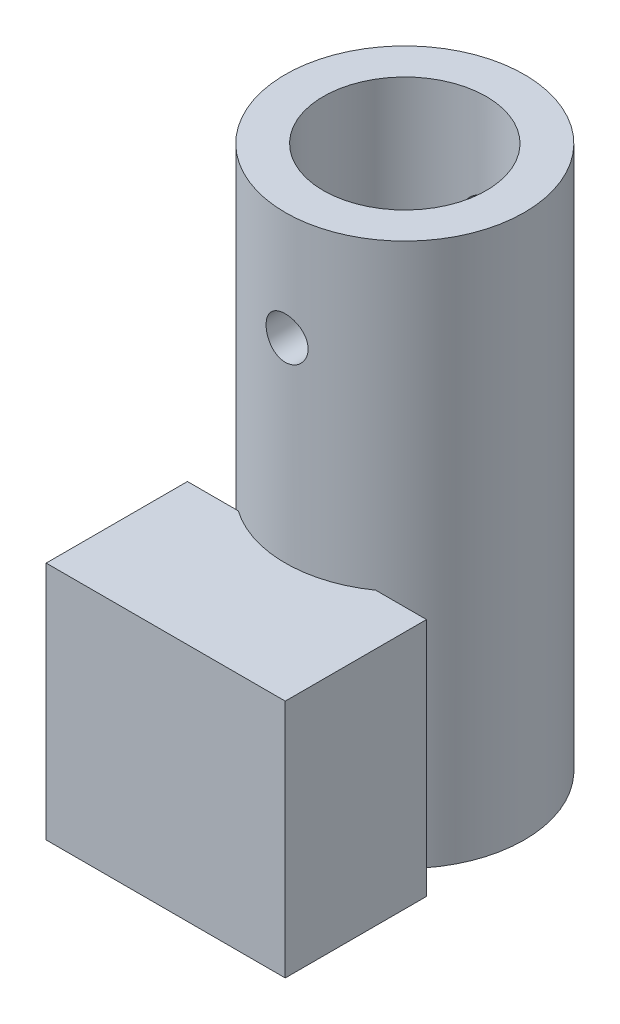
ISO-10303-21;
HEADER;
FILE_DESCRIPTION(('STEP AP214'),'2;1');
FILE_NAME('part.step','',(''),(''),'','','');
FILE_SCHEMA(('AUTOMOTIVE_DESIGN { 1 0 10303 214 1 1 1 1 }'));
ENDSEC;
DATA;
#1=APPLICATION_CONTEXT('core data for automotive mechanical design processes');
#2=APPLICATION_PROTOCOL_DEFINITION('international standard','automotive_design',2000,#1);
#3=PRODUCT_CONTEXT('',#1,'mechanical');
#4=PRODUCT('Part','Part','',(#3));
#5=PRODUCT_RELATED_PRODUCT_CATEGORY('part','',(#4));
#6=PRODUCT_DEFINITION_FORMATION('','',#4);
#7=PRODUCT_DEFINITION_CONTEXT('part definition',#1,'design');
#8=PRODUCT_DEFINITION('design','',#6,#7);
#9=PRODUCT_DEFINITION_SHAPE('','',#8);
#10=(LENGTH_UNIT() NAMED_UNIT(*) SI_UNIT(.MILLI.,.METRE.));
#11=(NAMED_UNIT(*) PLANE_ANGLE_UNIT() SI_UNIT($,.RADIAN.));
#12=(NAMED_UNIT(*) SI_UNIT($,.STERADIAN.) SOLID_ANGLE_UNIT());
#13=UNCERTAINTY_MEASURE_WITH_UNIT(LENGTH_MEASURE(1.E-05),#10,'distance_accuracy_value','');
#14=(GEOMETRIC_REPRESENTATION_CONTEXT(3) GLOBAL_UNCERTAINTY_ASSIGNED_CONTEXT((#13)) GLOBAL_UNIT_ASSIGNED_CONTEXT((#10,
#11,#12)) REPRESENTATION_CONTEXT('',''));
#15=CARTESIAN_POINT('',(0.,0.,0.));
#16=DIRECTION('',(0.,0.,1.));
#17=DIRECTION('',(1.,0.,0.));
#18=AXIS2_PLACEMENT_3D('',#15,#16,#17);
#19=CARTESIAN_POINT('',(0.,50.,0.));
#20=DIRECTION('',(0.,-1.,0.));
#21=DIRECTION('',(0.,0.,-1.));
#22=AXIS2_PLACEMENT_3D('',#19,#20,#21);
#23=CYLINDRICAL_SURFACE('',#22,11.);
#24=CARTESIAN_POINT('',(0.,41.935,-11.));
#25=CARTESIAN_POINT('',(-0.107798300732466,41.9349957604423,-10.9999980996234));
#26=CARTESIAN_POINT('',(-0.215653190352968,41.9259614447859,-10.9983989460169));
#27=CARTESIAN_POINT('',(-0.428331828274748,41.8900814433527,-10.9921736555933));
#28=CARTESIAN_POINT('',(-0.533152801481266,41.8632199570773,-10.987544833584));
#29=CARTESIAN_POINT('',(-0.736656342304242,41.7925268546714,-10.9757787933153));
#30=CARTESIAN_POINT('',(-0.835344073440022,41.7487097442508,-10.96864371966));
#31=CARTESIAN_POINT('',(-1.02395593211921,41.6453885879771,-10.9526473802527));
#32=CARTESIAN_POINT('',(-1.11388093398723,41.5858861093729,-10.9437862869841));
#33=CARTESIAN_POINT('',(-1.28337904046798,41.4522129081652,-10.9252133580473));
#34=CARTESIAN_POINT('',(-1.36284578997306,41.3779083236972,-10.9154942459053));
#35=CARTESIAN_POINT('',(-1.50825231814859,41.21702821766,-10.8963556449968));
#36=CARTESIAN_POINT('',(-1.57419119394373,41.1304518777029,-10.8869361762643));
#37=CARTESIAN_POINT('',(-1.69110342781324,40.9467461317815,-10.8693928195898));
#38=CARTESIAN_POINT('',(-1.74197030891694,40.8495479870297,-10.8612783264002));
#39=CARTESIAN_POINT('',(-1.82661342355483,40.6478197516009,-10.8473653474859));
#40=CARTESIAN_POINT('',(-1.86039094751275,40.543290215199,-10.8415666868987));
#41=CARTESIAN_POINT('',(-1.90955872088715,40.3309984978618,-10.8330147262082));
#42=CARTESIAN_POINT('',(-1.92513340824958,40.2232802870632,-10.8302309002416));
#43=CARTESIAN_POINT('',(-1.93802552688535,40.0067263262623,-10.8279316043739));
#44=CARTESIAN_POINT('',(-1.93534439770384,39.8978906650514,-10.82841587677));
#45=CARTESIAN_POINT('',(-1.91195092983359,39.6835162353439,-10.8325702229002));
#46=CARTESIAN_POINT('',(-1.89144686334163,39.5779539216925,-10.8362034971524));
#47=CARTESIAN_POINT('',(-1.83331689917424,39.3717913884573,-10.8461887816728));
#48=CARTESIAN_POINT('',(-1.79569035357035,39.2711913568099,-10.8525408948235));
#49=CARTESIAN_POINT('',(-1.70417558000238,39.0771916233636,-10.8672873363215));
#50=CARTESIAN_POINT('',(-1.6502018957683,38.9838330792564,-10.8756923505991));
#51=CARTESIAN_POINT('',(-1.52758552913526,38.8074190667515,-10.8935902992068));
#52=CARTESIAN_POINT('',(-1.45894153134716,38.7243645233009,-10.9030833310567));
#53=CARTESIAN_POINT('',(-1.30780340794176,38.5697114916149,-10.9222488122133));
#54=CARTESIAN_POINT('',(-1.22513082099987,38.4982873764564,-10.9319219268388));
#55=CARTESIAN_POINT('',(-1.04888309423207,38.3702974940319,-10.9502365753995));
#56=CARTESIAN_POINT('',(-0.955307868495456,38.3137318438593,-10.958878101205));
#57=CARTESIAN_POINT('',(-0.759739470105757,38.2170445203206,-10.9741703100929));
#58=CARTESIAN_POINT('',(-0.657737935531648,38.1769394230366,-10.9808189845293));
#59=CARTESIAN_POINT('',(-0.448303463594468,38.1144796591589,-10.9913605256456));
#60=CARTESIAN_POINT('',(-0.34087103410041,38.0921233360464,-10.9952536495013));
#61=CARTESIAN_POINT('',(-0.125126131602164,38.0660348324668,-10.9998105393369));
#62=CARTESIAN_POINT('',(-0.0168434269159108,38.062063474325,-11.0005157750175));
#63=CARTESIAN_POINT('',(0.198839479246955,38.0722182952537,-10.9987314265803));
#64=CARTESIAN_POINT('',(0.306239718496716,38.0863436956045,-10.9962419799325));
#65=CARTESIAN_POINT('',(0.516361680017287,38.1320921501891,-10.9883737169537));
#66=CARTESIAN_POINT('',(0.619110231632479,38.1635956682617,-10.9830146467512));
#67=CARTESIAN_POINT('',(0.817867386070802,38.2430778330117,-10.9700055402181));
#68=CARTESIAN_POINT('',(0.913875574961641,38.2910574904409,-10.9623553633402));
#69=CARTESIAN_POINT('',(1.09745781955809,38.402669824816,-10.9455094112871));
#70=CARTESIAN_POINT('',(1.18494054974232,38.4664505090025,-10.9362992983878));
#71=CARTESIAN_POINT('',(1.34804686850675,38.6076522372847,-10.9173954634863));
#72=CARTESIAN_POINT('',(1.42366948986564,38.685074392784,-10.9077017021261));
#73=CARTESIAN_POINT('',(1.56180513954747,38.8524384969719,-10.8887875146657));
#74=CARTESIAN_POINT('',(1.62415585191624,38.9425153070373,-10.8795738868835));
#75=CARTESIAN_POINT('',(1.73284091238269,39.1320048243113,-10.8627942623141));
#76=CARTESIAN_POINT('',(1.77917580830503,39.2314172120463,-10.8552282091746));
#77=CARTESIAN_POINT('',(1.85427658379618,39.4363200641377,-10.8426524166645));
#78=CARTESIAN_POINT('',(1.88312050121377,39.5417811983743,-10.8376313393446));
#79=CARTESIAN_POINT('',(1.92266414887922,39.7561481516085,-10.8306866209408));
#80=CARTESIAN_POINT('',(1.93336565573024,39.865053632253,-10.8287626765698));
#81=CARTESIAN_POINT('',(1.93626687128828,40.0815949496814,-10.8282441376828));
#82=CARTESIAN_POINT('',(1.92872228814715,40.1892273347505,-10.8296035288159));
#83=CARTESIAN_POINT('',(1.89590137941687,40.4016650425193,-10.8353971364659));
#84=CARTESIAN_POINT('',(1.87062513100653,40.506470377522,-10.8398313395993));
#85=CARTESIAN_POINT('',(1.80316068873677,40.7101634088313,-10.8512566409745));
#86=CARTESIAN_POINT('',(1.76099695964016,40.8090594287686,-10.8582440391436));
#87=CARTESIAN_POINT('',(1.66098137013199,40.9984151383559,-10.8739915643097));
#88=CARTESIAN_POINT('',(1.6031285877568,41.0888743317978,-10.882751795479));
#89=CARTESIAN_POINT('',(1.47247461621247,41.2600758432618,-10.9012025140866));
#90=CARTESIAN_POINT('',(1.39948615043526,41.3406741027276,-10.9109037564993));
#91=CARTESIAN_POINT('',(1.24102594293576,41.4885653507267,-10.9300599557264));
#92=CARTESIAN_POINT('',(1.15555133204841,41.5558552727771,-10.9395148553442));
#93=CARTESIAN_POINT('',(0.973750949857101,41.6757035683908,-10.9571988746708));
#94=CARTESIAN_POINT('',(0.877345868203405,41.7281431548607,-10.9654178765861));
#95=CARTESIAN_POINT('',(0.676985586704339,41.8160004318573,-10.9796055640486));
#96=CARTESIAN_POINT('',(0.573037837468801,41.8514346636333,-10.9855764351479));
#97=CARTESIAN_POINT('',(0.390605747327076,41.8967961789258,-10.9933286777153));
#98=CARTESIAN_POINT('',(0.313209862898434,41.9110990153308,-10.9958167297828));
#99=CARTESIAN_POINT('',(0.157219337263767,41.9302023745171,-10.9991530671462));
#100=CARTESIAN_POINT('',(0.0786247206788862,41.9350030922012,-11.0000013860755));
#101=CARTESIAN_POINT('',(0.,41.935,-11.));
#102=B_SPLINE_CURVE_WITH_KNOTS('',3,(#24,#25,#26,#27,#28,#29,#30,#31,#32,#33,#34,#35,#36,#37,
#38,#39,#40,#41,#42,#43,#44,#45,#46,#47,#48,#49,#50,#51,#52,#53,#54,#55,#56,#57,#58,#59,#60,#61,
#62,#63,#64,#65,#66,#67,#68,#69,#70,#71,#72,#73,#74,#75,#76,#77,#78,#79,#80,#81,#82,#83,#84,#85,
#86,#87,#88,#89,#90,#91,#92,#93,#94,#95,#96,#97,#98,#99,#100,#101),.UNSPECIFIED.,.T.,.F.,(4,2,2,
2,2,2,2,2,2,2,2,2,2,2,2,2,2,2,2,2,2,2,2,2,2,2,2,2,2,2,2,2,2,2,2,2,2,2,4),(0.,0.323107447197429,
0.646501652681637,0.969619800605967,1.29270567547517,1.61885808937813,1.94503226421979,
2.27345859304107,2.60186011856532,2.92690448959888,3.251923229863,3.57319421807926,
3.89447736446079,4.2174699203214,4.54049144892878,4.86798154151709,5.1954742148394,
5.52329587495172,5.85108693539623,6.17460141356272,6.49810197107546,6.81940457263364,
7.14072688847164,7.46518103509412,7.78966162801418,8.11790769974874,8.44614254263986,
8.77290194469031,9.09962934684071,9.42180445491817,9.74397816070528,10.0656868144076,
10.3874143773437,10.7133896528243,11.0394399516508,11.3680290438382,11.6962978635946,
11.9319671989006,12.1676317002197),.UNSPECIFIED.);
#103=CARTESIAN_POINT('',(0.,41.935,-11.));
#104=VERTEX_POINT('',#103);
#105=EDGE_CURVE('E142',#104,#104,#102,.T.);
#106=ORIENTED_EDGE('',*,*,#105,.T.);
#107=EDGE_LOOP('',(#106));
#108=FACE_BOUND('',#107,.T.);
#109=CARTESIAN_POINT('',(1.935,40.,10.8284705752936));
#110=CARTESIAN_POINT('',(1.93499574853755,39.8922162451031,10.8284725893971));
#111=CARTESIAN_POINT('',(1.92596378846799,39.7843758666896,10.8300973078839));
#112=CARTESIAN_POINT('',(1.89009399182154,39.5717273666734,10.8364137863099));
#113=CARTESIAN_POINT('',(1.86324030050737,39.4669220318571,10.8411082771543));
#114=CARTESIAN_POINT('',(1.79256999084182,39.2634515950013,10.853016529543));
#115=CARTESIAN_POINT('',(1.74876824557947,39.164781197009,10.8602280816501));
#116=CARTESIAN_POINT('',(1.64548329887357,38.9761985092646,10.876355285038));
#117=CARTESIAN_POINT('',(1.58600162849069,38.8862853655868,10.8852707699158));
#118=CARTESIAN_POINT('',(1.45234966973699,38.7167744004669,10.9039105266286));
#119=CARTESIAN_POINT('',(1.3780408525079,38.637286566215,10.9136418820687));
#120=CARTESIAN_POINT('',(1.21714335843051,38.4918391921289,10.9327541345797));
#121=CARTESIAN_POINT('',(1.13055392139233,38.4258804903883,10.9421350099098));
#122=CARTESIAN_POINT('',(0.946836173898078,38.308947095553,10.9595647093219));
#123=CARTESIAN_POINT('',(0.849641377666937,38.2580753542068,10.9676042244816));
#124=CARTESIAN_POINT('',(0.647920399116483,38.1734223373944,10.9813663374638));
#125=CARTESIAN_POINT('',(0.543394748042319,38.1396398249769,10.9870891029712));
#126=CARTESIAN_POINT('',(0.331117087773755,38.0904622569949,10.995522897195));
#127=CARTESIAN_POINT('',(0.223409180014938,38.0748821160419,10.9982642216657));
#128=CARTESIAN_POINT('',(0.00687555250102919,38.061975517667,11.0005304940157));
#129=CARTESIAN_POINT('',(-0.101950082397506,38.0646476846305,11.0000556842841));
#130=CARTESIAN_POINT('',(-0.316362888467173,38.0880265364185,10.9959670364676));
#131=CARTESIAN_POINT('',(-0.421972539379184,38.1085339902991,10.9923878770401));
#132=CARTESIAN_POINT('',(-0.628227980064162,38.1666869734296,10.9825314372781));
#133=CARTESIAN_POINT('',(-0.728873605359216,38.2043330701285,10.976254067608));
#134=CARTESIAN_POINT('',(-0.922930251180134,38.295889177031,10.9616479369522));
#135=CARTESIAN_POINT('',(-1.01630224054765,38.3498802245606,10.9533089934714));
#136=CARTESIAN_POINT('',(-1.19273586799729,38.4725341140617,10.935504374105));
#137=CARTESIAN_POINT('',(-1.27579657812861,38.5411982750108,10.9260385969615));
#138=CARTESIAN_POINT('',(-1.43042844581992,38.6923512567167,10.9068802994464));
#139=CARTESIAN_POINT('',(-1.50182924908665,38.7750142900563,10.8971864434054));
#140=CARTESIAN_POINT('',(-1.62977657086292,38.9512344068196,10.8787875875423));
#141=CARTESIAN_POINT('',(-1.68632292028936,39.0447916142304,10.8700825989767));
#142=CARTESIAN_POINT('',(-1.78299610574292,39.2403540149316,10.8546458350599));
#143=CARTESIAN_POINT('',(-1.82310061341606,39.3423704716483,10.8479167465148));
#144=CARTESIAN_POINT('',(-1.88555467891446,39.5518375392301,10.8372366065611));
#145=CARTESIAN_POINT('',(-1.90790599076062,39.6592876121364,10.8332852807134));
#146=CARTESIAN_POINT('',(-1.93397552796256,39.8750424512423,10.8286616854474));
#147=CARTESIAN_POINT('',(-1.93793741192634,39.9833168859175,10.8279465400777));
#148=CARTESIAN_POINT('',(-1.92776659552939,40.198981020864,10.8297618465244));
#149=CARTESIAN_POINT('',(-1.91363467759461,40.3063707591897,10.8322921579983));
#150=CARTESIAN_POINT('',(-1.86788577941721,40.5164315257679,10.840273522505));
#151=CARTESIAN_POINT('',(-1.83639441348221,40.6191307800221,10.8457035840023));
#152=CARTESIAN_POINT('',(-1.75695294380663,40.8177946773773,10.8588548031925));
#153=CARTESIAN_POINT('',(-1.70900175579265,40.9137588763121,10.8665761118144));
#154=CARTESIAN_POINT('',(-1.59743288225755,41.0973082984876,10.8835386021612));
#155=CARTESIAN_POINT('',(-1.53366000668246,41.1847978041181,10.8927945185677));
#156=CARTESIAN_POINT('',(-1.39246942548561,41.347921395965,10.9117409396742));
#157=CARTESIAN_POINT('',(-1.31505064605038,41.4235545483043,10.9214314785303));
#158=CARTESIAN_POINT('',(-1.14768259349554,41.5617170532962,10.9402918209418));
#159=CARTESIAN_POINT('',(-1.05759772738292,41.6240833149374,10.9494542343387));
#160=CARTESIAN_POINT('',(-0.868087556160912,41.7327956207474,10.9661049917731));
#161=CARTESIAN_POINT('',(-0.768662579122865,41.7791422273392,10.973593394579));
#162=CARTESIAN_POINT('',(-0.56376438203063,41.854249944736,10.9860204163005));
#163=CARTESIAN_POINT('',(-0.458322376321753,41.8830941337412,10.9909710634299));
#164=CARTESIAN_POINT('',(-0.243996097068897,41.9226447908804,10.9978158236253));
#165=CARTESIAN_POINT('',(-0.135112141465561,41.9333529293238,10.9997102181678));
#166=CARTESIAN_POINT('',(0.08143749398107,41.9362751088781,11.0002243524477));
#167=CARTESIAN_POINT('',(0.189099811305215,41.9287364996503,10.998887889417));
#168=CARTESIAN_POINT('',(0.401598959322069,41.8959170745163,10.9931805663424));
#169=CARTESIAN_POINT('',(0.506435810419884,41.8706363867765,10.9888097282185));
#170=CARTESIAN_POINT('',(0.710197969703897,41.8031494347866,10.9775236535447));
#171=CARTESIAN_POINT('',(0.809131209409462,41.7609664950959,10.9706119244224));
#172=CARTESIAN_POINT('',(0.998553458520875,41.6609008520625,10.9549958470054));
#173=CARTESIAN_POINT('',(1.08904199468149,41.6030172695576,10.9462913983335));
#174=CARTESIAN_POINT('',(1.2602465974113,41.4723274196824,10.9279136060408));
#175=CARTESIAN_POINT('',(1.34082401316346,41.3993410309346,10.9182293647678));
#176=CARTESIAN_POINT('',(1.48867417029126,41.2408938128045,10.8990559850883));
#177=CARTESIAN_POINT('',(1.55594378842538,41.1554300632383,10.8895668929488));
#178=CARTESIAN_POINT('',(1.67576779146767,40.9736404040531,10.8717759120457));
#179=CARTESIAN_POINT('',(1.72820033576775,40.8772331789932,10.8634841123962));
#180=CARTESIAN_POINT('',(1.81604387056572,40.676868825736,10.849146611922));
#181=CARTESIAN_POINT('',(1.85147146539472,40.5729191769416,10.8430987213679));
#182=CARTESIAN_POINT('',(1.89681613352542,40.3905043690584,10.8352408787082));
#183=CARTESIAN_POINT('',(1.91111144745289,40.3131287988889,10.8327165385563));
#184=CARTESIAN_POINT('',(1.93020482756559,40.1571788401004,10.8293306705265));
#185=CARTESIAN_POINT('',(1.9350031005042,40.0786044776169,10.8284691064494));
#186=CARTESIAN_POINT('',(1.935,40.,10.8284705752936));
#187=B_SPLINE_CURVE_WITH_KNOTS('',3,(#109,#110,#111,#112,#113,#114,#115,#116,#117,#118,#119,
#120,#121,#122,#123,#124,#125,#126,#127,#128,#129,#130,#131,#132,#133,#134,#135,#136,#137,#138,
#139,#140,#141,#142,#143,#144,#145,#146,#147,#148,#149,#150,#151,#152,#153,#154,#155,#156,#157,
#158,#159,#160,#161,#162,#163,#164,#165,#166,#167,#168,#169,#170,#171,#172,#173,#174,#175,#176,
#177,#178,#179,#180,#181,#182,#183,#184,#185,#186),.UNSPECIFIED.,.T.,.F.,(4,2,2,2,2,2,2,2,2,2,2,
2,2,2,2,2,2,2,2,2,2,2,2,2,2,2,2,2,2,2,2,2,2,2,2,2,2,2,4),(0.,0.323063733987833,
0.646415260951128,0.969483665840715,1.29252053650896,1.61873016898046,1.94496000316714,
2.27336731168046,2.6017508460385,2.92676541986307,3.25175549870991,3.57316120437233,
3.89457755233975,4.21761431367595,4.5406801252634,4.8681098547002,5.19554331099464,
5.5234199672779,5.85126422522148,6.17475192969743,6.49822564614437,6.81938883624284,
7.14057318668844,7.4650419411336,7.78953623984442,8.11781453399066,8.4460813016719,
8.77277745141208,9.09944351117486,9.42170620199971,9.74396656486632,10.0657837420784,
10.3876189432631,10.713539999894,11.0395374572735,11.3681390437766,11.6964191141586,
11.9320279861073,12.167631728725),.UNSPECIFIED.);
#188=CARTESIAN_POINT('',(1.935,40.,10.8284705752936));
#189=VERTEX_POINT('',#188);
#190=EDGE_CURVE('E136',#189,#189,#187,.T.);
#191=ORIENTED_EDGE('',*,*,#190,.T.);
#192=EDGE_LOOP('',(#191));
#193=FACE_BOUND('',#192,.T.);
#194=CARTESIAN_POINT('',(0.,50.,0.));
#195=DIRECTION('',(0.,1.,0.));
#196=DIRECTION('',(0.,0.,1.));
#197=AXIS2_PLACEMENT_3D('',#194,#195,#196);
#198=CIRCLE('',#197,11.);
#199=CARTESIAN_POINT('',(0.,50.,11.));
#200=VERTEX_POINT('',#199);
#201=EDGE_CURVE('E41',#200,#200,#198,.T.);
#202=ORIENTED_EDGE('',*,*,#201,.F.);
#203=EDGE_LOOP('',(#202));
#204=FACE_BOUND('',#203,.T.);
#205=CARTESIAN_POINT('',(0.,22.065,0.));
#206=DIRECTION('',(0.,1.,0.));
#207=DIRECTION('',(0.,0.,1.));
#208=AXIS2_PLACEMENT_3D('',#205,#206,#207);
#209=CIRCLE('',#208,11.);
#210=CARTESIAN_POINT('',(-6.32455532033676,22.065,9.));
#211=VERTEX_POINT('',#210);
#212=CARTESIAN_POINT('',(6.32455532033676,22.065,9.));
#213=VERTEX_POINT('',#212);
#214=EDGE_CURVE('E11',#211,#213,#209,.T.);
#215=ORIENTED_EDGE('',*,*,#214,.T.);
#216=DIRECTION('',(0.,-1.,0.));
#217=VECTOR('',#216,1.);
#218=CARTESIAN_POINT('',(6.32455532033676,50.,9.));
#219=LINE('',#218,#217);
#220=CARTESIAN_POINT('',(6.32455532033676,0.,9.));
#221=VERTEX_POINT('',#220);
#222=EDGE_CURVE('E133',#213,#221,#219,.T.);
#223=ORIENTED_EDGE('',*,*,#222,.T.);
#224=CARTESIAN_POINT('',(0.,0.,0.));
#225=DIRECTION('',(0.,1.,0.));
#226=DIRECTION('',(0.,0.,1.));
#227=AXIS2_PLACEMENT_3D('',#224,#225,#226);
#228=CIRCLE('',#227,11.);
#229=CARTESIAN_POINT('',(-6.32455532033676,0.,9.));
#230=VERTEX_POINT('',#229);
#231=EDGE_CURVE('E185',#221,#230,#228,.T.);
#232=ORIENTED_EDGE('',*,*,#231,.T.);
#233=DIRECTION('',(0.,-1.,0.));
#234=VECTOR('',#233,1.);
#235=CARTESIAN_POINT('',(-6.32455532033676,50.,9.));
#236=LINE('',#235,#234);
#237=EDGE_CURVE('E127',#230,#211,#236,.F.);
#238=ORIENTED_EDGE('',*,*,#237,.T.);
#239=EDGE_LOOP('',(#215,#223,#232,#238));
#240=FACE_BOUND('',#239,.T.);
#241=ADVANCED_FACE('F33',(#108,#193,#204,#240),#23,.T.);
#242=CARTESIAN_POINT('',(0.,50.,0.));
#243=DIRECTION('',(0.,1.,0.));
#244=DIRECTION('',(0.,0.,1.));
#245=AXIS2_PLACEMENT_3D('',#242,#243,#244);
#246=PLANE('',#245);
#247=CARTESIAN_POINT('',(0.,50.,0.));
#248=DIRECTION('',(0.,1.,0.));
#249=DIRECTION('',(0.,0.,1.));
#250=AXIS2_PLACEMENT_3D('',#247,#248,#249);
#251=CIRCLE('',#250,7.5);
#252=CARTESIAN_POINT('',(0.,50.,7.5));
#253=VERTEX_POINT('',#252);
#254=EDGE_CURVE('E178',#253,#253,#251,.T.);
#255=ORIENTED_EDGE('',*,*,#254,.F.);
#256=EDGE_LOOP('',(#255));
#257=FACE_BOUND('',#256,.T.);
#258=ORIENTED_EDGE('',*,*,#201,.T.);
#259=EDGE_LOOP('',(#258));
#260=FACE_BOUND('',#259,.T.);
#261=ADVANCED_FACE('F202',(#257,#260),#246,.T.);
#262=CARTESIAN_POINT('',(0.,0.,0.));
#263=DIRECTION('',(0.,1.,0.));
#264=DIRECTION('',(0.,0.,1.));
#265=AXIS2_PLACEMENT_3D('',#262,#263,#264);
#266=PLANE('',#265);
#267=CARTESIAN_POINT('',(0.,0.,0.));
#268=DIRECTION('',(0.,1.,0.));
#269=DIRECTION('',(0.,0.,1.));
#270=AXIS2_PLACEMENT_3D('',#267,#268,#269);
#271=CIRCLE('',#270,7.5);
#272=CARTESIAN_POINT('',(0.,0.,7.5));
#273=VERTEX_POINT('',#272);
#274=EDGE_CURVE('E180',#273,#273,#271,.T.);
#275=ORIENTED_EDGE('',*,*,#274,.T.);
#276=EDGE_LOOP('',(#275));
#277=FACE_BOUND('',#276,.T.);
#278=ORIENTED_EDGE('',*,*,#231,.F.);
#279=DIRECTION('',(1.,0.,0.));
#280=VECTOR('',#279,1.);
#281=CARTESIAN_POINT('',(11.,0.,9.));
#282=LINE('',#281,#280);
#283=CARTESIAN_POINT('',(11.,0.,9.));
#284=VERTEX_POINT('',#283);
#285=EDGE_CURVE('E56',#221,#284,#282,.T.);
#286=ORIENTED_EDGE('',*,*,#285,.T.);
#287=DIRECTION('',(0.,0.,1.));
#288=VECTOR('',#287,1.);
#289=CARTESIAN_POINT('',(11.,0.,9.));
#290=LINE('',#289,#288);
#291=CARTESIAN_POINT('',(11.,0.,22.));
#292=VERTEX_POINT('',#291);
#293=EDGE_CURVE('E96',#284,#292,#290,.T.);
#294=ORIENTED_EDGE('',*,*,#293,.T.);
#295=DIRECTION('',(1.,0.,0.));
#296=VECTOR('',#295,1.);
#297=CARTESIAN_POINT('',(11.,0.,22.));
#298=LINE('',#297,#296);
#299=CARTESIAN_POINT('',(-11.,0.,22.));
#300=VERTEX_POINT('',#299);
#301=EDGE_CURVE('E100',#300,#292,#298,.T.);
#302=ORIENTED_EDGE('',*,*,#301,.F.);
#303=DIRECTION('',(0.,0.,1.));
#304=VECTOR('',#303,1.);
#305=CARTESIAN_POINT('',(-11.,0.,9.));
#306=LINE('',#305,#304);
#307=CARTESIAN_POINT('',(-11.,0.,9.));
#308=VERTEX_POINT('',#307);
#309=EDGE_CURVE('E86',#308,#300,#306,.T.);
#310=ORIENTED_EDGE('',*,*,#309,.F.);
#311=EDGE_CURVE('E118',#308,#230,#282,.T.);
#312=ORIENTED_EDGE('',*,*,#311,.T.);
#313=EDGE_LOOP('',(#278,#286,#294,#302,#310,#312));
#314=FACE_BOUND('',#313,.T.);
#315=ADVANCED_FACE('F102',(#277,#314),#266,.F.);
#316=CARTESIAN_POINT('',(0.,0.,0.));
#317=DIRECTION('',(0.,1.,0.));
#318=DIRECTION('',(0.,0.,1.));
#319=AXIS2_PLACEMENT_3D('',#316,#317,#318);
#320=CYLINDRICAL_SURFACE('',#319,7.5);
#321=CARTESIAN_POINT('',(0.,38.065,7.5));
#322=CARTESIAN_POINT('',(0.106797237980942,38.0650027866041,7.49999827753044));
#323=CARTESIAN_POINT('',(0.213624985265451,38.0738712869985,7.49769627387667));
#324=CARTESIAN_POINT('',(0.424211351923698,38.1090532856317,7.48873641802475));
#325=CARTESIAN_POINT('',(0.527968326082703,38.1353759645923,7.48207627351277));
#326=CARTESIAN_POINT('',(0.729342304167862,38.2045598288629,7.46513650944404));
#327=CARTESIAN_POINT('',(0.826966764737471,38.2474004585645,7.45486138989458));
#328=CARTESIAN_POINT('',(1.01364419072762,38.3483299705762,7.4317819964575));
#329=CARTESIAN_POINT('',(1.10269673188584,38.4064196070975,7.41897759748024));
#330=CARTESIAN_POINT('',(1.27164595410486,38.5375370199307,7.39191366269842));
#331=CARTESIAN_POINT('',(1.35132890210553,38.6108353359182,7.37763052004198));
#332=CARTESIAN_POINT('',(1.49741829768282,38.7697106384958,7.34937322807968));
#333=CARTESIAN_POINT('',(1.56382314929492,38.8552890989806,7.33539911609716));
#334=CARTESIAN_POINT('',(1.682493969367,39.0379769299804,7.30910246240488));
#335=CARTESIAN_POINT('',(1.73451764186757,39.1352483860722,7.29680980373955));
#336=CARTESIAN_POINT('',(1.82139001670731,39.3375251325166,7.27561349297241));
#337=CARTESIAN_POINT('',(1.85624166232676,39.4425290939712,7.26670926015501));
#338=CARTESIAN_POINT('',(1.90704531320303,39.6549318988084,7.25354112214285));
#339=CARTESIAN_POINT('',(1.92338314801486,39.7622324548243,7.24918264306365));
#340=CARTESIAN_POINT('',(1.93789772553221,39.9781331540935,7.24531665887671));
#341=CARTESIAN_POINT('',(1.93607762850987,40.0867330679157,7.24580830963466));
#342=CARTESIAN_POINT('',(1.91463512178359,40.2991671317297,7.2515021937783));
#343=CARTESIAN_POINT('',(1.89547580387018,40.403051826889,7.25658188395652));
#344=CARTESIAN_POINT('',(1.8406388527732,40.6060801133457,7.27068376704329));
#345=CARTESIAN_POINT('',(1.80495997488177,40.7052233467645,7.27970625702913));
#346=CARTESIAN_POINT('',(1.71771026226252,40.8971797520056,7.30078736963518));
#347=CARTESIAN_POINT('',(1.66597407111552,40.9899141777475,7.31287733263246));
#348=CARTESIAN_POINT('',(1.54819383832336,41.1655497285931,7.33871386593056));
#349=CARTESIAN_POINT('',(1.48214714419809,41.248449026322,7.35246074313385));
#350=CARTESIAN_POINT('',(1.3352365757102,41.4047111985414,7.38057537486749));
#351=CARTESIAN_POINT('',(1.25398280232459,41.4777068859194,7.39494928988412));
#352=CARTESIAN_POINT('',(1.08021332511655,41.6091083723438,7.42232199870712));
#353=CARTESIAN_POINT('',(0.987697231967451,41.6675136668022,7.43532074494629));
#354=CARTESIAN_POINT('',(0.79348430014447,41.7682238815366,7.45855022247645));
#355=CARTESIAN_POINT('',(0.691753486209102,41.81046594827,7.46877010399517));
#356=CARTESIAN_POINT('',(0.482311360627632,41.8771446246891,7.48521169832409));
#357=CARTESIAN_POINT('',(0.37460127450731,41.9015848686833,7.4914342271781));
#358=CARTESIAN_POINT('',(0.159394761691713,41.931397923828,7.49905799092621));
#359=CARTESIAN_POINT('',(0.0519719230296768,41.9372703794175,7.50058553190108));
#360=CARTESIAN_POINT('',(-0.162322541949958,41.9311560114195,7.49900855398848));
#361=CARTESIAN_POINT('',(-0.269194220346652,41.9191709074091,7.49590448109792));
#362=CARTESIAN_POINT('',(-0.477594189710328,41.8780925620636,7.48549430327971));
#363=CARTESIAN_POINT('',(-0.579180468493374,41.8492747859352,7.47825589766758));
#364=CARTESIAN_POINT('',(-0.776069519075939,41.7756662441903,7.46039522868072));
#365=CARTESIAN_POINT('',(-0.871371632151986,41.7308738072097,7.44977261124205));
#366=CARTESIAN_POINT('',(-1.05495307138853,41.6256388146322,7.42602237183994));
#367=CARTESIAN_POINT('',(-1.14306845648893,41.564920204902,7.41285176264739));
#368=CARTESIAN_POINT('',(-1.30803595733531,41.429906526982,7.3855294717554));
#369=CARTESIAN_POINT('',(-1.3848859915781,41.3556089554859,7.37137760945921));
#370=CARTESIAN_POINT('',(-1.52722241851429,41.1932206388303,7.34322835503841));
#371=CARTESIAN_POINT('',(-1.59235731570364,41.1048188608842,7.32924478358042));
#372=CARTESIAN_POINT('',(-1.70687133145588,40.9180479992832,7.30342723279713));
#373=CARTESIAN_POINT('',(-1.75625113464513,40.8196793489765,7.29159316007652));
#374=CARTESIAN_POINT('',(-1.83748229784448,40.6162804281956,7.27154798250107));
#375=CARTESIAN_POINT('',(-1.86943688157303,40.5112935903476,7.26331560065668));
#376=CARTESIAN_POINT('',(-1.91517052070486,40.2971906788723,7.25139234886506));
#377=CARTESIAN_POINT('',(-1.92895386318593,40.1880755854614,7.24770040772125));
#378=CARTESIAN_POINT('',(-1.93771893545041,39.9724004676903,7.24536143825446));
#379=CARTESIAN_POINT('',(-1.93326390954601,39.8658646179749,7.24656327223757));
#380=CARTESIAN_POINT('',(-1.90697603242405,39.6551184844763,7.25352490785594));
#381=CARTESIAN_POINT('',(-1.88514357547916,39.5509081479852,7.25928460607882));
#382=CARTESIAN_POINT('',(-1.82503729750969,39.3484291634409,7.2746260197283));
#383=CARTESIAN_POINT('',(-1.78687560213936,39.2501251159768,7.28418163876276));
#384=CARTESIAN_POINT('',(-1.6952819079712,39.0612425747335,7.30604039800807));
#385=CARTESIAN_POINT('',(-1.64184765737253,38.9706652227451,7.31834394331742));
#386=CARTESIAN_POINT('',(-1.51948769094102,38.7971010984101,7.34473762685807));
#387=CARTESIAN_POINT('',(-1.4501741908664,38.7143937525012,7.35886778424153));
#388=CARTESIAN_POINT('',(-1.29877038953271,38.5616011639977,7.3870911092543));
#389=CARTESIAN_POINT('',(-1.21667702641004,38.4915189548993,7.40118426719415));
#390=CARTESIAN_POINT('',(-1.04009839654822,38.3646189098781,7.4280762440431));
#391=CARTESIAN_POINT('',(-0.945401458825964,38.3080885488563,7.44084421408099));
#392=CARTESIAN_POINT('',(-0.747524790654888,38.211839507394,7.4633163045272));
#393=CARTESIAN_POINT('',(-0.644350898642338,38.172109369948,7.47302251177042));
#394=CARTESIAN_POINT('',(-0.451210527393178,38.1161498805291,7.48692696366465));
#395=CARTESIAN_POINT('',(-0.362123973227896,38.0970115759082,7.49179471828687));
#396=CARTESIAN_POINT('',(-0.182032223973633,38.0714359928549,7.49833183333084));
#397=CARTESIAN_POINT('',(-0.0910271941507128,38.0649976248754,7.50000146812383));
#398=CARTESIAN_POINT('',(0.,38.065,7.5));
#399=B_SPLINE_CURVE_WITH_KNOTS('',3,(#321,#322,#323,#324,#325,#326,#327,#328,#329,#330,#331,
#332,#333,#334,#335,#336,#337,#338,#339,#340,#341,#342,#343,#344,#345,#346,#347,#348,#349,#350,
#351,#352,#353,#354,#355,#356,#357,#358,#359,#360,#361,#362,#363,#364,#365,#366,#367,#368,#369,
#370,#371,#372,#373,#374,#375,#376,#377,#378,#379,#380,#381,#382,#383,#384,#385,#386,#387,#388,
#389,#390,#391,#392,#393,#394,#395,#396,#397,#398),.UNSPECIFIED.,.T.,.F.,(4,2,2,2,2,2,2,2,2,2,2,
2,2,2,2,2,2,2,2,2,2,2,2,2,2,2,2,2,2,2,2,2,2,2,2,2,2,2,4),(0.,0.320058020632128,
0.640284522236368,0.960113800514298,1.27995890043142,1.60607467839967,1.93222963041484,
2.263584491094,2.59488253787505,2.91914145417912,3.24334393627304,3.559135245784,
3.87495035325947,4.19413210300335,4.51337306440431,4.84233356885451,5.17130544835764,
5.50154389721729,5.83171490775466,6.15292216449937,6.47409849288833,6.79016048067539,
7.1062555464515,7.42824034151337,7.75028455504165,8.08078756190602,8.41127620504197,
8.73978521933102,9.06821671575241,9.38658319030134,9.70494244171001,10.0211498824194,
10.3374039691419,10.662409972261,10.9874939621252,11.3189611773435,11.6502019806801,
11.9230225508258,12.1958197142578),.UNSPECIFIED.);
#400=CARTESIAN_POINT('',(0.,38.065,7.5));
#401=VERTEX_POINT('',#400);
#402=EDGE_CURVE('E143',#401,#401,#399,.T.);
#403=ORIENTED_EDGE('',*,*,#402,.T.);
#404=EDGE_LOOP('',(#403));
#405=FACE_BOUND('',#404,.T.);
#406=CARTESIAN_POINT('',(1.935,40.,-7.24608687499674));
#407=CARTESIAN_POINT('',(1.93499717639665,39.8932694775152,-7.24608883513091));
#408=CARTESIAN_POINT('',(1.92613937135368,39.7865083707244,-7.24847075448196));
#409=CARTESIAN_POINT('',(1.8910036987853,39.5760602257888,-7.25771478031131));
#410=CARTESIAN_POINT('',(1.86471635762064,39.4723748914854,-7.26457932324135));
#411=CARTESIAN_POINT('',(1.79563575276686,39.2711528855191,-7.28196055591799));
#412=CARTESIAN_POINT('',(1.7528646919394,39.1736081474658,-7.29247233110859));
#413=CARTESIAN_POINT('',(1.65209932153402,38.9870658706879,-7.31595742938945));
#414=CARTESIAN_POINT('',(1.5941041098761,38.8980688388693,-7.32893089833036));
#415=CARTESIAN_POINT('',(1.46308486569426,38.7290635852391,-7.35621796161816));
#416=CARTESIAN_POINT('',(1.38976902785719,38.6492851738817,-7.37055408926406));
#417=CARTESIAN_POINT('',(1.23081777922174,38.5030096470577,-7.39875614468958));
#418=CARTESIAN_POINT('',(1.14518115992427,38.4365138359613,-7.41262202617946));
#419=CARTESIAN_POINT('',(0.962435820767243,38.3177423103202,-7.43857160013222));
#420=CARTESIAN_POINT('',(0.865174958748849,38.2656936377555,-7.4506256054359));
#421=CARTESIAN_POINT('',(0.662920851418588,38.1787721975153,-7.47133549901215));
#422=CARTESIAN_POINT('',(0.557928826658279,38.1438967252881,-7.47999192231529));
#423=CARTESIAN_POINT('',(0.345589946890852,38.0930513927937,-7.4927719952342));
#424=CARTESIAN_POINT('',(0.238342342423238,38.0766909572795,-7.49698915202));
#425=CARTESIAN_POINT('',(0.0225473563948116,38.0621127816816,-7.50074189529084));
#426=CARTESIAN_POINT('',(-0.0859998183341294,38.0638921919207,-7.50027821711131));
#427=CARTESIAN_POINT('',(-0.298599250496155,38.0852650568496,-7.4947906242197));
#428=CARTESIAN_POINT('',(-0.402697118504099,38.1044367390424,-7.48987468406149));
#429=CARTESIAN_POINT('',(-0.606145098349467,38.1593703615283,-7.47616144390189));
#430=CARTESIAN_POINT('',(-0.705494948256818,38.1951332159304,-7.46736393004218));
#431=CARTESIAN_POINT('',(-0.897721584614785,38.2825667153108,-7.44671323737208));
#432=CARTESIAN_POINT('',(-0.990528155767373,38.3343848100351,-7.43483190844603));
#433=CARTESIAN_POINT('',(-1.16627439967112,38.4523454007184,-7.40929833697522));
#434=CARTESIAN_POINT('',(-1.24921225274491,38.5184905320952,-7.39564576880154));
#435=CARTESIAN_POINT('',(-1.40538326279431,38.6654782532365,-7.36758992825101));
#436=CARTESIAN_POINT('',(-1.4782683583568,38.7466890965916,-7.35317635902613));
#437=CARTESIAN_POINT('',(-1.60946621432046,38.9203310044982,-7.32558023726089));
#438=CARTESIAN_POINT('',(-1.6677781994168,39.0127626656205,-7.31239775023875));
#439=CARTESIAN_POINT('',(-1.7684171307173,39.2069390534266,-7.2887173397525));
#440=CARTESIAN_POINT('',(-1.81065520066072,39.3087318037523,-7.27823444310065));
#441=CARTESIAN_POINT('',(-1.87730764083231,39.5183103612375,-7.26132985953393));
#442=CARTESIAN_POINT('',(-1.90172610879739,39.6260947844328,-7.2549072389768));
#443=CARTESIAN_POINT('',(-1.93145809259938,39.8413562890819,-7.24704776573394));
#444=CARTESIAN_POINT('',(-1.93728840077645,39.94875715051,-7.24547608665803));
#445=CARTESIAN_POINT('',(-1.93109766423525,40.1629981735902,-7.24712855535059));
#446=CARTESIAN_POINT('',(-1.91907838270854,40.2698383895769,-7.25035222943166));
#447=CARTESIAN_POINT('',(-1.87798396562013,40.477972386411,-7.26110248829948));
#448=CARTESIAN_POINT('',(-1.8492143141145,40.5793308500135,-7.26855194459644));
#449=CARTESIAN_POINT('',(-1.77577677454106,40.7757852365477,-7.2868401703174));
#450=CARTESIAN_POINT('',(-1.73110691046674,40.8708803793608,-7.29767936098193));
#451=CARTESIAN_POINT('',(-1.62607068963073,41.054285404369,-7.32180624338853));
#452=CARTESIAN_POINT('',(-1.56539795508351,41.1424136187559,-7.33514006140082));
#453=CARTESIAN_POINT('',(-1.43046204657452,41.307427774431,-7.36264286151711));
#454=CARTESIAN_POINT('',(-1.35619648747588,41.3843117384211,-7.376811989897));
#455=CARTESIAN_POINT('',(-1.19380246468261,41.5267728294066,-7.40484926308714));
#456=CARTESIAN_POINT('',(-1.10535541216863,41.591991081827,-7.41869912137024));
#457=CARTESIAN_POINT('',(-0.918466738624296,41.7066516545495,-7.44414528694588));
#458=CARTESIAN_POINT('',(-0.820025646342415,41.7560948088822,-7.45574171336485));
#459=CARTESIAN_POINT('',(-0.616631951064672,41.8373597494127,-7.47530030280294));
#460=CARTESIAN_POINT('',(-0.51173371838555,41.8693109076679,-7.48328906905821));
#461=CARTESIAN_POINT('',(-0.29782179110361,41.9150674929898,-7.4948489955978));
#462=CARTESIAN_POINT('',(-0.188808950859719,41.928876665975,-7.49842106782268));
#463=CARTESIAN_POINT('',(0.0268752344078012,41.9377351870381,-7.50070514151063));
#464=CARTESIAN_POINT('',(0.133523759487465,41.9333126123378,-7.4995539553973));
#465=CARTESIAN_POINT('',(0.34450412177958,41.9070505664228,-7.49282708782103));
#466=CARTESIAN_POINT('',(0.448836036128192,41.8852116760156,-7.48725155390333));
#467=CARTESIAN_POINT('',(0.651629737847866,41.8250275960457,-7.4723264928502));
#468=CARTESIAN_POINT('',(0.750123320059496,41.7867834308529,-7.46300008534965));
#469=CARTESIAN_POINT('',(0.939351812643972,41.6949652356963,-7.44155203073968));
#470=CARTESIAN_POINT('',(1.03008568893743,41.6413891666833,-7.42943001187274));
#471=CARTESIAN_POINT('',(1.20370186605682,41.5188481947457,-7.40331074550269));
#472=CARTESIAN_POINT('',(1.2863280096719,41.4495288243147,-7.38927387129088));
#473=CARTESIAN_POINT('',(1.43895418346912,41.2981496446994,-7.36107653047144));
#474=CARTESIAN_POINT('',(1.50895095221686,41.2160865547035,-7.34691603292603));
#475=CARTESIAN_POINT('',(1.63572602347117,41.0395533592671,-7.31974714697687));
#476=CARTESIAN_POINT('',(1.69220858331425,40.9448660218714,-7.30676782729729));
#477=CARTESIAN_POINT('',(1.78837068536365,40.7470169453532,-7.28383078719304));
#478=CARTESIAN_POINT('',(1.82806187626929,40.6438611405877,-7.27387097340614));
#479=CARTESIAN_POINT('',(1.88394040299757,40.4508150621136,-7.25957573814403));
#480=CARTESIAN_POINT('',(1.90304451761342,40.3618087587409,-7.25455681208426));
#481=CARTESIAN_POINT('',(1.92857489720084,40.1818755801426,-7.24781170689845));
#482=CARTESIAN_POINT('',(1.93500240609337,40.0909488942441,-7.24608520469633));
#483=CARTESIAN_POINT('',(1.935,40.,-7.24608687499674));
#484=B_SPLINE_CURVE_WITH_KNOTS('',3,(#406,#407,#408,#409,#410,#411,#412,#413,#414,#415,#416,
#417,#418,#419,#420,#421,#422,#423,#424,#425,#426,#427,#428,#429,#430,#431,#432,#433,#434,#435,
#436,#437,#438,#439,#440,#441,#442,#443,#444,#445,#446,#447,#448,#449,#450,#451,#452,#453,#454,
#455,#456,#457,#458,#459,#460,#461,#462,#463,#464,#465,#466,#467,#468,#469,#470,#471,#472,#473,
#474,#475,#476,#477,#478,#479,#480,#481,#482,#483),.UNSPECIFIED.,.T.,.F.,(4,2,2,2,2,2,2,2,2,2,2,
2,2,2,2,2,2,2,2,2,2,2,2,2,2,2,2,2,2,2,2,2,2,2,2,2,2,2,4),(0.,0.319857369958396,
0.639888737670773,0.959490535036793,1.27911127411541,1.60548915336495,1.93189906764538,
2.26318054360309,2.59440983041639,2.91851339099692,3.24256603734443,3.55896434244483,
3.87538008193393,4.19479249067947,4.51426370440729,4.84293070733298,5.1716151919689,
5.50209151699943,5.83249182281617,6.15362233316488,6.47472112418797,6.79013959069521,
7.10559726967681,7.42759861562636,7.74965651750781,8.08035872411118,8.41104344356634,
8.73924816527366,9.06738510931691,9.38608544227134,9.70477514750312,10.0215299030105,
10.3383268045504,10.6631242651623,10.9880054824272,11.3194527048461,11.6506696133695,
11.9232582641833,12.1958201652801),.UNSPECIFIED.);
#485=CARTESIAN_POINT('',(1.935,40.,-7.24608687499674));
#486=VERTEX_POINT('',#485);
#487=EDGE_CURVE('E135',#486,#486,#484,.T.);
#488=ORIENTED_EDGE('',*,*,#487,.T.);
#489=EDGE_LOOP('',(#488));
#490=FACE_BOUND('',#489,.T.);
#491=ORIENTED_EDGE('',*,*,#274,.F.);
#492=EDGE_LOOP('',(#491));
#493=FACE_BOUND('',#492,.T.);
#494=ORIENTED_EDGE('',*,*,#254,.T.);
#495=EDGE_LOOP('',(#494));
#496=FACE_BOUND('',#495,.T.);
#497=ADVANCED_FACE('F153',(#405,#490,#493,#496),#320,.F.);
#498=CARTESIAN_POINT('',(0.,40.,-38.));
#499=DIRECTION('',(0.,0.,1.));
#500=DIRECTION('',(1.,0.,0.));
#501=AXIS2_PLACEMENT_3D('',#498,#499,#500);
#502=CYLINDRICAL_SURFACE('',#501,1.935);
#503=ORIENTED_EDGE('',*,*,#487,.F.);
#504=EDGE_LOOP('',(#503));
#505=FACE_BOUND('',#504,.T.);
#506=ORIENTED_EDGE('',*,*,#105,.F.);
#507=EDGE_LOOP('',(#506));
#508=FACE_BOUND('',#507,.T.);
#509=ADVANCED_FACE('F147',(#505,#508),#502,.F.);
#510=ORIENTED_EDGE('',*,*,#402,.F.);
#511=EDGE_LOOP('',(#510));
#512=FACE_BOUND('',#511,.T.);
#513=ORIENTED_EDGE('',*,*,#190,.F.);
#514=EDGE_LOOP('',(#513));
#515=FACE_BOUND('',#514,.T.);
#516=ADVANCED_FACE('F152',(#512,#515),#502,.F.);
#517=CARTESIAN_POINT('',(0.,0.,9.));
#518=DIRECTION('',(0.,0.,-1.));
#519=DIRECTION('',(-1.,0.,0.));
#520=AXIS2_PLACEMENT_3D('',#517,#518,#519);
#521=PLANE('',#520);
#522=ORIENTED_EDGE('',*,*,#222,.F.);
#523=DIRECTION('',(-1.,0.,0.));
#524=VECTOR('',#523,1.);
#525=CARTESIAN_POINT('',(-11.,22.065,9.));
#526=LINE('',#525,#524);
#527=CARTESIAN_POINT('',(11.,22.065,9.));
#528=VERTEX_POINT('',#527);
#529=EDGE_CURVE('E97',#528,#213,#526,.T.);
#530=ORIENTED_EDGE('',*,*,#529,.F.);
#531=DIRECTION('',(0.,1.,0.));
#532=VECTOR('',#531,1.);
#533=CARTESIAN_POINT('',(11.,22.065,9.));
#534=LINE('',#533,#532);
#535=EDGE_CURVE('E120',#284,#528,#534,.T.);
#536=ORIENTED_EDGE('',*,*,#535,.F.);
#537=ORIENTED_EDGE('',*,*,#285,.F.);
#538=EDGE_LOOP('',(#522,#530,#536,#537));
#539=FACE_BOUND('',#538,.T.);
#540=ADVANCED_FACE('F192',(#539),#521,.T.);
#541=ORIENTED_EDGE('',*,*,#237,.F.);
#542=ORIENTED_EDGE('',*,*,#311,.F.);
#543=DIRECTION('',(0.,-1.,0.));
#544=VECTOR('',#543,1.);
#545=CARTESIAN_POINT('',(-11.,0.,9.));
#546=LINE('',#545,#544);
#547=CARTESIAN_POINT('',(-11.,22.065,9.));
#548=VERTEX_POINT('',#547);
#549=EDGE_CURVE('E92',#548,#308,#546,.T.);
#550=ORIENTED_EDGE('',*,*,#549,.F.);
#551=EDGE_CURVE('E48',#211,#548,#526,.T.);
#552=ORIENTED_EDGE('',*,*,#551,.F.);
#553=EDGE_LOOP('',(#541,#542,#550,#552));
#554=FACE_BOUND('',#553,.T.);
#555=ADVANCED_FACE('F190',(#554),#521,.T.);
#556=CARTESIAN_POINT('',(-11.,0.,9.));
#557=DIRECTION('',(-1.,0.,0.));
#558=DIRECTION('',(0.,0.,1.));
#559=AXIS2_PLACEMENT_3D('',#556,#557,#558);
#560=PLANE('',#559);
#561=ORIENTED_EDGE('',*,*,#309,.T.);
#562=DIRECTION('',(0.,-1.,0.));
#563=VECTOR('',#562,1.);
#564=CARTESIAN_POINT('',(-11.,0.,22.));
#565=LINE('',#564,#563);
#566=CARTESIAN_POINT('',(-11.,22.065,22.));
#567=VERTEX_POINT('',#566);
#568=EDGE_CURVE('E91',#567,#300,#565,.T.);
#569=ORIENTED_EDGE('',*,*,#568,.F.);
#570=DIRECTION('',(0.,0.,1.));
#571=VECTOR('',#570,1.);
#572=CARTESIAN_POINT('',(-11.,22.065,9.));
#573=LINE('',#572,#571);
#574=EDGE_CURVE('E125',#548,#567,#573,.T.);
#575=ORIENTED_EDGE('',*,*,#574,.F.);
#576=ORIENTED_EDGE('',*,*,#549,.T.);
#577=EDGE_LOOP('',(#561,#569,#575,#576));
#578=FACE_BOUND('',#577,.T.);
#579=ADVANCED_FACE('F88',(#578),#560,.T.);
#580=CARTESIAN_POINT('',(-11.,22.065,9.));
#581=DIRECTION('',(0.,1.,0.));
#582=DIRECTION('',(0.,0.,1.));
#583=AXIS2_PLACEMENT_3D('',#580,#581,#582);
#584=PLANE('',#583);
#585=ORIENTED_EDGE('',*,*,#214,.F.);
#586=ORIENTED_EDGE('',*,*,#551,.T.);
#587=ORIENTED_EDGE('',*,*,#574,.T.);
#588=DIRECTION('',(-1.,0.,0.));
#589=VECTOR('',#588,1.);
#590=CARTESIAN_POINT('',(-11.,22.065,22.));
#591=LINE('',#590,#589);
#592=CARTESIAN_POINT('',(11.,22.065,22.));
#593=VERTEX_POINT('',#592);
#594=EDGE_CURVE('E112',#593,#567,#591,.T.);
#595=ORIENTED_EDGE('',*,*,#594,.F.);
#596=DIRECTION('',(0.,0.,1.));
#597=VECTOR('',#596,1.);
#598=CARTESIAN_POINT('',(11.,22.065,9.));
#599=LINE('',#598,#597);
#600=EDGE_CURVE('E128',#528,#593,#599,.T.);
#601=ORIENTED_EDGE('',*,*,#600,.F.);
#602=ORIENTED_EDGE('',*,*,#529,.T.);
#603=EDGE_LOOP('',(#585,#586,#587,#595,#601,#602));
#604=FACE_BOUND('',#603,.T.);
#605=ADVANCED_FACE('F198',(#604),#584,.T.);
#606=CARTESIAN_POINT('',(11.,22.065,9.));
#607=DIRECTION('',(1.,0.,0.));
#608=DIRECTION('',(0.,0.,-1.));
#609=AXIS2_PLACEMENT_3D('',#606,#607,#608);
#610=PLANE('',#609);
#611=ORIENTED_EDGE('',*,*,#600,.T.);
#612=DIRECTION('',(0.,1.,0.));
#613=VECTOR('',#612,1.);
#614=CARTESIAN_POINT('',(11.,22.065,22.));
#615=LINE('',#614,#613);
#616=EDGE_CURVE('E107',#292,#593,#615,.T.);
#617=ORIENTED_EDGE('',*,*,#616,.F.);
#618=ORIENTED_EDGE('',*,*,#293,.F.);
#619=ORIENTED_EDGE('',*,*,#535,.T.);
#620=EDGE_LOOP('',(#611,#617,#618,#619));
#621=FACE_BOUND('',#620,.T.);
#622=ADVANCED_FACE('F247',(#621),#610,.T.);
#623=CARTESIAN_POINT('',(0.,0.,22.));
#624=DIRECTION('',(0.,0.,-1.));
#625=DIRECTION('',(-1.,0.,0.));
#626=AXIS2_PLACEMENT_3D('',#623,#624,#625);
#627=PLANE('',#626);
#628=ORIENTED_EDGE('',*,*,#568,.T.);
#629=ORIENTED_EDGE('',*,*,#301,.T.);
#630=ORIENTED_EDGE('',*,*,#616,.T.);
#631=ORIENTED_EDGE('',*,*,#594,.T.);
#632=EDGE_LOOP('',(#628,#629,#630,#631));
#633=FACE_BOUND('',#632,.T.);
#634=ADVANCED_FACE('F110',(#633),#627,.F.);
#635=CLOSED_SHELL('',(#241,#261,#315,#497,#509,#516,#540,#555,#579,#605,#622,#634));
#636=MANIFOLD_SOLID_BREP('B2',#635);
#637=ADVANCED_BREP_SHAPE_REPRESENTATION('',(#18,#636),#14);
#638=SHAPE_DEFINITION_REPRESENTATION(#9,#637);
ENDSEC;
END-ISO-10303-21;
